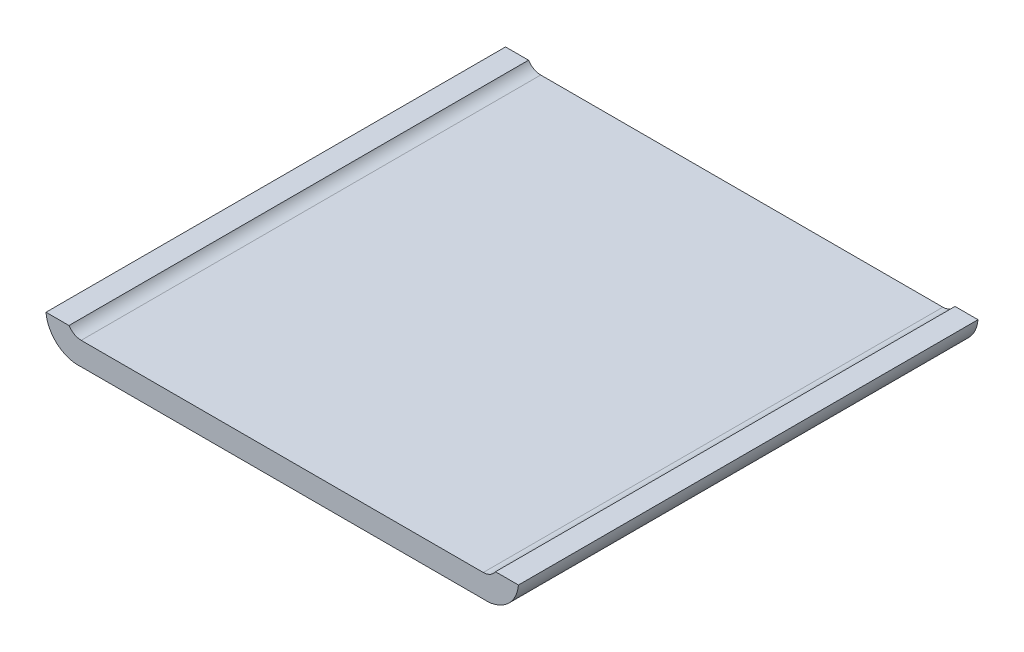
ISO-10303-21;
HEADER;
FILE_DESCRIPTION(('STEP AP214'),'2;1');
FILE_NAME('part.step','',(''),(''),'','','');
FILE_SCHEMA(('AUTOMOTIVE_DESIGN { 1 0 10303 214 1 1 1 1 }'));
ENDSEC;
DATA;
#1=APPLICATION_CONTEXT('core data for automotive mechanical design processes');
#2=APPLICATION_PROTOCOL_DEFINITION('international standard','automotive_design',2000,#1);
#3=PRODUCT_CONTEXT('',#1,'mechanical');
#4=PRODUCT('Part','Part','',(#3));
#5=PRODUCT_RELATED_PRODUCT_CATEGORY('part','',(#4));
#6=PRODUCT_DEFINITION_FORMATION('','',#4);
#7=PRODUCT_DEFINITION_CONTEXT('part definition',#1,'design');
#8=PRODUCT_DEFINITION('design','',#6,#7);
#9=PRODUCT_DEFINITION_SHAPE('','',#8);
#10=(LENGTH_UNIT() NAMED_UNIT(*) SI_UNIT(.MILLI.,.METRE.));
#11=(NAMED_UNIT(*) PLANE_ANGLE_UNIT() SI_UNIT($,.RADIAN.));
#12=(NAMED_UNIT(*) SI_UNIT($,.STERADIAN.) SOLID_ANGLE_UNIT());
#13=UNCERTAINTY_MEASURE_WITH_UNIT(LENGTH_MEASURE(1.E-05),#10,'distance_accuracy_value','');
#14=(GEOMETRIC_REPRESENTATION_CONTEXT(3) GLOBAL_UNCERTAINTY_ASSIGNED_CONTEXT((#13)) GLOBAL_UNIT_ASSIGNED_CONTEXT((#10,
#11,#12)) REPRESENTATION_CONTEXT('',''));
#15=CARTESIAN_POINT('',(0.,0.,0.));
#16=DIRECTION('',(0.,0.,1.));
#17=DIRECTION('',(1.,0.,0.));
#18=AXIS2_PLACEMENT_3D('',#15,#16,#17);
#19=CARTESIAN_POINT('',(-175.,10.,400.));
#20=DIRECTION('',(0.,-1.,0.));
#21=DIRECTION('',(0.,0.,-1.));
#22=AXIS2_PLACEMENT_3D('',#19,#20,#21);
#23=PLANE('',#22);
#24=DIRECTION('',(-1.,0.,0.));
#25=VECTOR('',#24,1.);
#26=CARTESIAN_POINT('',(-175.,10.,0.));
#27=LINE('',#26,#25);
#28=CARTESIAN_POINT('',(175.,10.,0.));
#29=VERTEX_POINT('',#28);
#30=CARTESIAN_POINT('',(-175.,10.,0.));
#31=VERTEX_POINT('',#30);
#32=EDGE_CURVE('E60',#29,#31,#27,.T.);
#33=ORIENTED_EDGE('',*,*,#32,.T.);
#34=DIRECTION('',(0.,0.,-1.));
#35=VECTOR('',#34,1.);
#36=CARTESIAN_POINT('',(-175.,10.,400.));
#37=LINE('',#36,#35);
#38=CARTESIAN_POINT('',(-175.,10.,400.));
#39=VERTEX_POINT('',#38);
#40=EDGE_CURVE('E40',#39,#31,#37,.T.);
#41=ORIENTED_EDGE('',*,*,#40,.F.);
#42=DIRECTION('',(-1.,0.,0.));
#43=VECTOR('',#42,1.);
#44=CARTESIAN_POINT('',(-175.,10.,400.));
#45=LINE('',#44,#43);
#46=CARTESIAN_POINT('',(175.,10.,400.));
#47=VERTEX_POINT('',#46);
#48=EDGE_CURVE('E88',#47,#39,#45,.T.);
#49=ORIENTED_EDGE('',*,*,#48,.F.);
#50=DIRECTION('',(0.,0.,-1.));
#51=VECTOR('',#50,1.);
#52=CARTESIAN_POINT('',(175.,10.,400.));
#53=LINE('',#52,#51);
#54=EDGE_CURVE('E11',#47,#29,#53,.T.);
#55=ORIENTED_EDGE('',*,*,#54,.T.);
#56=EDGE_LOOP('',(#33,#41,#49,#55));
#57=FACE_BOUND('',#56,.T.);
#58=ADVANCED_FACE('F32',(#57),#23,.F.);
#59=CARTESIAN_POINT('',(-175.,-10.,400.));
#60=DIRECTION('',(0.,1.,0.));
#61=DIRECTION('',(0.,0.,1.));
#62=AXIS2_PLACEMENT_3D('',#59,#60,#61);
#63=PLANE('',#62);
#64=DIRECTION('',(1.,0.,0.));
#65=VECTOR('',#64,1.);
#66=CARTESIAN_POINT('',(-175.,-10.,0.));
#67=LINE('',#66,#65);
#68=CARTESIAN_POINT('',(-175.,-10.,0.));
#69=VERTEX_POINT('',#68);
#70=CARTESIAN_POINT('',(175.,-10.,0.));
#71=VERTEX_POINT('',#70);
#72=EDGE_CURVE('E99',#69,#71,#67,.T.);
#73=ORIENTED_EDGE('',*,*,#72,.T.);
#74=DIRECTION('',(0.,0.,-1.));
#75=VECTOR('',#74,1.);
#76=CARTESIAN_POINT('',(175.,-10.,400.));
#77=LINE('',#76,#75);
#78=CARTESIAN_POINT('',(175.,-10.,400.));
#79=VERTEX_POINT('',#78);
#80=EDGE_CURVE('E126',#79,#71,#77,.T.);
#81=ORIENTED_EDGE('',*,*,#80,.F.);
#82=DIRECTION('',(1.,0.,0.));
#83=VECTOR('',#82,1.);
#84=CARTESIAN_POINT('',(-175.,-10.,400.));
#85=LINE('',#84,#83);
#86=CARTESIAN_POINT('',(-175.,-10.,400.));
#87=VERTEX_POINT('',#86);
#88=EDGE_CURVE('E48',#87,#79,#85,.T.);
#89=ORIENTED_EDGE('',*,*,#88,.F.);
#90=DIRECTION('',(0.,0.,-1.));
#91=VECTOR('',#90,1.);
#92=CARTESIAN_POINT('',(-175.,-10.,400.));
#93=LINE('',#92,#91);
#94=EDGE_CURVE('E104',#87,#69,#93,.T.);
#95=ORIENTED_EDGE('',*,*,#94,.T.);
#96=EDGE_LOOP('',(#73,#81,#89,#95));
#97=FACE_BOUND('',#96,.T.);
#98=ADVANCED_FACE('F135',(#97),#63,.F.);
#99=CARTESIAN_POINT('',(0.,0.,400.));
#100=DIRECTION('',(0.,0.,-1.));
#101=DIRECTION('',(-1.,0.,0.));
#102=AXIS2_PLACEMENT_3D('',#99,#100,#101);
#103=PLANE('',#102);
#104=ORIENTED_EDGE('',*,*,#88,.T.);
#105=CARTESIAN_POINT('',(177.369415548906,18.2448896754125,400.));
#106=DIRECTION('',(0.,0.,-1.));
#107=DIRECTION('',(-1.,0.,0.));
#108=AXIS2_PLACEMENT_3D('',#105,#106,#107);
#109=CIRCLE('',#108,28.3440985536606);
#110=CARTESIAN_POINT('',(205.614305224319,15.8754741265064,400.));
#111=VERTEX_POINT('',#110);
#112=EDGE_CURVE('E261',#111,#79,#109,.T.);
#113=ORIENTED_EDGE('',*,*,#112,.F.);
#114=DIRECTION('',(-1.,0.,0.));
#115=VECTOR('',#114,1.);
#116=CARTESIAN_POINT('',(205.614305224319,15.8754741265064,400.));
#117=LINE('',#116,#115);
#118=CARTESIAN_POINT('',(185.614305224319,15.8754741265064,400.));
#119=VERTEX_POINT('',#118);
#120=EDGE_CURVE('E254',#111,#119,#117,.T.);
#121=ORIENTED_EDGE('',*,*,#120,.T.);
#122=CARTESIAN_POINT('',(174.801713898737,22.883556862615,400.));
#123=DIRECTION('',(0.,0.,-1.));
#124=DIRECTION('',(-1.,0.,0.));
#125=AXIS2_PLACEMENT_3D('',#122,#123,#124);
#126=CIRCLE('',#125,12.8850826466185);
#127=EDGE_CURVE('E96',#119,#47,#126,.T.);
#128=ORIENTED_EDGE('',*,*,#127,.T.);
#129=ORIENTED_EDGE('',*,*,#48,.T.);
#130=CARTESIAN_POINT('',(-174.801713898737,22.883556862615,400.));
#131=DIRECTION('',(0.,0.,1.));
#132=DIRECTION('',(1.,0.,0.));
#133=AXIS2_PLACEMENT_3D('',#130,#131,#132);
#134=CIRCLE('',#133,12.8850826466185);
#135=CARTESIAN_POINT('',(-185.614305224319,15.8754741265064,400.));
#136=VERTEX_POINT('',#135);
#137=EDGE_CURVE('E93',#136,#39,#134,.T.);
#138=ORIENTED_EDGE('',*,*,#137,.F.);
#139=DIRECTION('',(1.,0.,0.));
#140=VECTOR('',#139,1.);
#141=CARTESIAN_POINT('',(-205.614305224319,15.8754741265064,400.));
#142=LINE('',#141,#140);
#143=CARTESIAN_POINT('',(-205.614305224319,15.8754741265064,400.));
#144=VERTEX_POINT('',#143);
#145=EDGE_CURVE('E108',#144,#136,#142,.T.);
#146=ORIENTED_EDGE('',*,*,#145,.F.);
#147=CARTESIAN_POINT('',(-177.369415548906,18.2448896754125,400.));
#148=DIRECTION('',(0.,0.,1.));
#149=DIRECTION('',(1.,0.,0.));
#150=AXIS2_PLACEMENT_3D('',#147,#148,#149);
#151=CIRCLE('',#150,28.3440985536606);
#152=EDGE_CURVE('E107',#144,#87,#151,.T.);
#153=ORIENTED_EDGE('',*,*,#152,.T.);
#154=EDGE_LOOP('',(#104,#113,#121,#128,#129,#138,#146,#153));
#155=FACE_BOUND('',#154,.T.);
#156=ADVANCED_FACE('F90',(#155),#103,.F.);
#157=CARTESIAN_POINT('',(0.,0.,0.));
#158=DIRECTION('',(0.,0.,-1.));
#159=DIRECTION('',(-1.,0.,0.));
#160=AXIS2_PLACEMENT_3D('',#157,#158,#159);
#161=PLANE('',#160);
#162=ORIENTED_EDGE('',*,*,#32,.F.);
#163=CARTESIAN_POINT('',(174.801713898737,22.883556862615,0.));
#164=DIRECTION('',(0.,0.,-1.));
#165=DIRECTION('',(-1.,0.,0.));
#166=AXIS2_PLACEMENT_3D('',#163,#164,#165);
#167=CIRCLE('',#166,12.8850826466185);
#168=CARTESIAN_POINT('',(185.614305224319,15.8754741265064,0.));
#169=VERTEX_POINT('',#168);
#170=EDGE_CURVE('E250',#169,#29,#167,.T.);
#171=ORIENTED_EDGE('',*,*,#170,.F.);
#172=DIRECTION('',(-1.,0.,0.));
#173=VECTOR('',#172,1.);
#174=CARTESIAN_POINT('',(205.614305224319,15.8754741265064,0.));
#175=LINE('',#174,#173);
#176=CARTESIAN_POINT('',(205.614305224319,15.8754741265064,0.));
#177=VERTEX_POINT('',#176);
#178=EDGE_CURVE('E251',#177,#169,#175,.T.);
#179=ORIENTED_EDGE('',*,*,#178,.F.);
#180=CARTESIAN_POINT('',(177.369415548906,18.2448896754125,0.));
#181=DIRECTION('',(0.,0.,-1.));
#182=DIRECTION('',(-1.,0.,0.));
#183=AXIS2_PLACEMENT_3D('',#180,#181,#182);
#184=CIRCLE('',#183,28.3440985536606);
#185=EDGE_CURVE('E143',#177,#71,#184,.T.);
#186=ORIENTED_EDGE('',*,*,#185,.T.);
#187=ORIENTED_EDGE('',*,*,#72,.F.);
#188=CARTESIAN_POINT('',(-177.369415548906,18.2448896754125,0.));
#189=DIRECTION('',(0.,0.,1.));
#190=DIRECTION('',(1.,0.,0.));
#191=AXIS2_PLACEMENT_3D('',#188,#189,#190);
#192=CIRCLE('',#191,28.3440985536606);
#193=CARTESIAN_POINT('',(-205.614305224319,15.8754741265064,0.));
#194=VERTEX_POINT('',#193);
#195=EDGE_CURVE('E111',#194,#69,#192,.T.);
#196=ORIENTED_EDGE('',*,*,#195,.F.);
#197=DIRECTION('',(1.,0.,0.));
#198=VECTOR('',#197,1.);
#199=CARTESIAN_POINT('',(-205.614305224319,15.8754741265064,0.));
#200=LINE('',#199,#198);
#201=CARTESIAN_POINT('',(-185.614305224319,15.8754741265064,0.));
#202=VERTEX_POINT('',#201);
#203=EDGE_CURVE('E115',#194,#202,#200,.T.);
#204=ORIENTED_EDGE('',*,*,#203,.T.);
#205=CARTESIAN_POINT('',(-174.801713898737,22.883556862615,0.));
#206=DIRECTION('',(0.,0.,1.));
#207=DIRECTION('',(1.,0.,0.));
#208=AXIS2_PLACEMENT_3D('',#205,#206,#207);
#209=CIRCLE('',#208,12.8850826466185);
#210=EDGE_CURVE('E118',#202,#31,#209,.T.);
#211=ORIENTED_EDGE('',*,*,#210,.T.);
#212=EDGE_LOOP('',(#162,#171,#179,#186,#187,#196,#204,#211));
#213=FACE_BOUND('',#212,.T.);
#214=ADVANCED_FACE('F140',(#213),#161,.T.);
#215=CARTESIAN_POINT('',(-205.614305224319,15.8754741265064,400.));
#216=DIRECTION('',(0.,1.,0.));
#217=DIRECTION('',(0.,0.,1.));
#218=AXIS2_PLACEMENT_3D('',#215,#216,#217);
#219=PLANE('',#218);
#220=ORIENTED_EDGE('',*,*,#203,.F.);
#221=DIRECTION('',(0.,0.,-1.));
#222=VECTOR('',#221,1.);
#223=CARTESIAN_POINT('',(-205.614305224319,15.8754741265064,400.));
#224=LINE('',#223,#222);
#225=EDGE_CURVE('E70',#144,#194,#224,.T.);
#226=ORIENTED_EDGE('',*,*,#225,.F.);
#227=ORIENTED_EDGE('',*,*,#145,.T.);
#228=DIRECTION('',(0.,0.,-1.));
#229=VECTOR('',#228,1.);
#230=CARTESIAN_POINT('',(-185.614305224319,15.8754741265064,400.));
#231=LINE('',#230,#229);
#232=EDGE_CURVE('E106',#136,#202,#231,.T.);
#233=ORIENTED_EDGE('',*,*,#232,.T.);
#234=EDGE_LOOP('',(#220,#226,#227,#233));
#235=FACE_BOUND('',#234,.T.);
#236=ADVANCED_FACE('F145',(#235),#219,.T.);
#237=CARTESIAN_POINT('',(-177.369415548906,18.2448896754125,400.));
#238=DIRECTION('',(0.,0.,-1.));
#239=DIRECTION('',(-1.,0.,0.));
#240=AXIS2_PLACEMENT_3D('',#237,#238,#239);
#241=CYLINDRICAL_SURFACE('',#240,28.3440985536606);
#242=ORIENTED_EDGE('',*,*,#195,.T.);
#243=ORIENTED_EDGE('',*,*,#94,.F.);
#244=ORIENTED_EDGE('',*,*,#152,.F.);
#245=ORIENTED_EDGE('',*,*,#225,.T.);
#246=EDGE_LOOP('',(#242,#243,#244,#245));
#247=FACE_BOUND('',#246,.T.);
#248=ADVANCED_FACE('F144',(#247),#241,.T.);
#249=CARTESIAN_POINT('',(-174.801713898737,22.883556862615,400.));
#250=DIRECTION('',(0.,0.,-1.));
#251=DIRECTION('',(-1.,0.,0.));
#252=AXIS2_PLACEMENT_3D('',#249,#250,#251);
#253=CYLINDRICAL_SURFACE('',#252,12.8850826466185);
#254=ORIENTED_EDGE('',*,*,#210,.F.);
#255=ORIENTED_EDGE('',*,*,#232,.F.);
#256=ORIENTED_EDGE('',*,*,#137,.T.);
#257=ORIENTED_EDGE('',*,*,#40,.T.);
#258=EDGE_LOOP('',(#254,#255,#256,#257));
#259=FACE_BOUND('',#258,.T.);
#260=ADVANCED_FACE('F105',(#259),#253,.F.);
#261=CARTESIAN_POINT('',(205.614305224319,15.8754741265064,400.));
#262=DIRECTION('',(0.,-1.,0.));
#263=DIRECTION('',(0.,0.,-1.));
#264=AXIS2_PLACEMENT_3D('',#261,#262,#263);
#265=PLANE('',#264);
#266=ORIENTED_EDGE('',*,*,#178,.T.);
#267=DIRECTION('',(0.,0.,-1.));
#268=VECTOR('',#267,1.);
#269=CARTESIAN_POINT('',(185.614305224319,15.8754741265064,400.));
#270=LINE('',#269,#268);
#271=EDGE_CURVE('E119',#119,#169,#270,.T.);
#272=ORIENTED_EDGE('',*,*,#271,.F.);
#273=ORIENTED_EDGE('',*,*,#120,.F.);
#274=DIRECTION('',(0.,0.,-1.));
#275=VECTOR('',#274,1.);
#276=CARTESIAN_POINT('',(205.614305224319,15.8754741265064,400.));
#277=LINE('',#276,#275);
#278=EDGE_CURVE('E247',#111,#177,#277,.T.);
#279=ORIENTED_EDGE('',*,*,#278,.T.);
#280=EDGE_LOOP('',(#266,#272,#273,#279));
#281=FACE_BOUND('',#280,.T.);
#282=ADVANCED_FACE('F176',(#281),#265,.F.);
#283=CARTESIAN_POINT('',(174.801713898737,22.883556862615,400.));
#284=DIRECTION('',(0.,0.,-1.));
#285=DIRECTION('',(-1.,0.,0.));
#286=AXIS2_PLACEMENT_3D('',#283,#284,#285);
#287=CYLINDRICAL_SURFACE('',#286,12.8850826466185);
#288=ORIENTED_EDGE('',*,*,#170,.T.);
#289=ORIENTED_EDGE('',*,*,#54,.F.);
#290=ORIENTED_EDGE('',*,*,#127,.F.);
#291=ORIENTED_EDGE('',*,*,#271,.T.);
#292=EDGE_LOOP('',(#288,#289,#290,#291));
#293=FACE_BOUND('',#292,.T.);
#294=ADVANCED_FACE('F180',(#293),#287,.F.);
#295=CARTESIAN_POINT('',(177.369415548906,18.2448896754125,400.));
#296=DIRECTION('',(0.,0.,-1.));
#297=DIRECTION('',(-1.,0.,0.));
#298=AXIS2_PLACEMENT_3D('',#295,#296,#297);
#299=CYLINDRICAL_SURFACE('',#298,28.3440985536606);
#300=ORIENTED_EDGE('',*,*,#185,.F.);
#301=ORIENTED_EDGE('',*,*,#278,.F.);
#302=ORIENTED_EDGE('',*,*,#112,.T.);
#303=ORIENTED_EDGE('',*,*,#80,.T.);
#304=EDGE_LOOP('',(#300,#301,#302,#303));
#305=FACE_BOUND('',#304,.T.);
#306=ADVANCED_FACE('F191',(#305),#299,.T.);
#307=CLOSED_SHELL('',(#58,#98,#156,#214,#236,#248,#260,#282,#294,#306));
#308=MANIFOLD_SOLID_BREP('B2',#307);
#309=ADVANCED_BREP_SHAPE_REPRESENTATION('',(#18,#308),#14);
#310=SHAPE_DEFINITION_REPRESENTATION(#9,#309);
ENDSEC;
END-ISO-10303-21;
